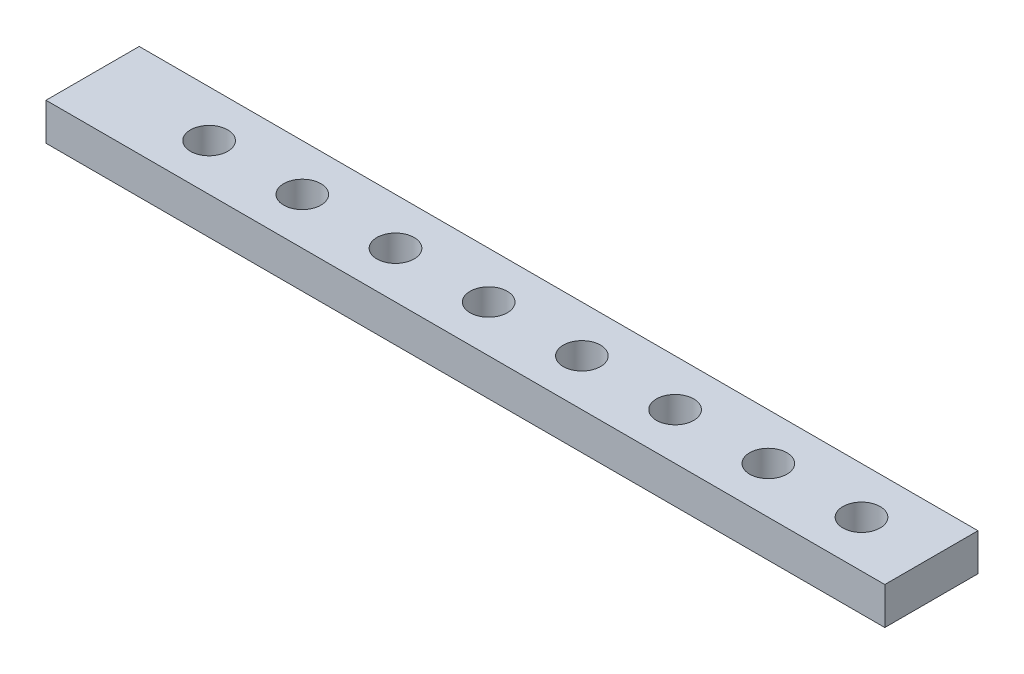
ISO-10303-21;
HEADER;
FILE_DESCRIPTION(('STEP AP214'),'2;1');
FILE_NAME('part.step','',(''),(''),'','','');
FILE_SCHEMA(('AUTOMOTIVE_DESIGN { 1 0 10303 214 1 1 1 1 }'));
ENDSEC;
DATA;
#1=APPLICATION_CONTEXT('core data for automotive mechanical design processes');
#2=APPLICATION_PROTOCOL_DEFINITION('international standard','automotive_design',2000,#1);
#3=PRODUCT_CONTEXT('',#1,'mechanical');
#4=PRODUCT('Part','Part','',(#3));
#5=PRODUCT_RELATED_PRODUCT_CATEGORY('part','',(#4));
#6=PRODUCT_DEFINITION_FORMATION('','',#4);
#7=PRODUCT_DEFINITION_CONTEXT('part definition',#1,'design');
#8=PRODUCT_DEFINITION('design','',#6,#7);
#9=PRODUCT_DEFINITION_SHAPE('','',#8);
#10=(LENGTH_UNIT() NAMED_UNIT(*) SI_UNIT(.MILLI.,.METRE.));
#11=(NAMED_UNIT(*) PLANE_ANGLE_UNIT() SI_UNIT($,.RADIAN.));
#12=(NAMED_UNIT(*) SI_UNIT($,.STERADIAN.) SOLID_ANGLE_UNIT());
#13=UNCERTAINTY_MEASURE_WITH_UNIT(LENGTH_MEASURE(1.E-05),#10,'distance_accuracy_value','');
#14=(GEOMETRIC_REPRESENTATION_CONTEXT(3) GLOBAL_UNCERTAINTY_ASSIGNED_CONTEXT((#13)) GLOBAL_UNIT_ASSIGNED_CONTEXT((#10,
#11,#12)) REPRESENTATION_CONTEXT('',''));
#15=CARTESIAN_POINT('',(0.,0.,0.));
#16=DIRECTION('',(0.,0.,1.));
#17=DIRECTION('',(1.,0.,0.));
#18=AXIS2_PLACEMENT_3D('',#15,#16,#17);
#19=CARTESIAN_POINT('',(0.,8.,0.));
#20=DIRECTION('',(0.,0.,-1.));
#21=DIRECTION('',(-1.,0.,0.));
#22=AXIS2_PLACEMENT_3D('',#19,#20,#21);
#23=PLANE('',#22);
#24=DIRECTION('',(0.,-1.,0.));
#25=VECTOR('',#24,1.);
#26=CARTESIAN_POINT('',(30.,10.,0.));
#27=LINE('',#26,#25);
#28=CARTESIAN_POINT('',(30.,8.,0.));
#29=VERTEX_POINT('',#28);
#30=CARTESIAN_POINT('',(30.,0.,0.));
#31=VERTEX_POINT('',#30);
#32=EDGE_CURVE('E200',#29,#31,#27,.T.);
#33=ORIENTED_EDGE('',*,*,#32,.T.);
#34=DIRECTION('',(1.,0.,0.));
#35=VECTOR('',#34,1.);
#36=CARTESIAN_POINT('',(0.,0.,0.));
#37=LINE('',#36,#35);
#38=CARTESIAN_POINT('',(210.,0.,0.));
#39=VERTEX_POINT('',#38);
#40=EDGE_CURVE('E80',#31,#39,#37,.T.);
#41=ORIENTED_EDGE('',*,*,#40,.T.);
#42=DIRECTION('',(0.,-1.,0.));
#43=VECTOR('',#42,1.);
#44=CARTESIAN_POINT('',(210.,8.,0.));
#45=LINE('',#44,#43);
#46=CARTESIAN_POINT('',(210.,8.,0.));
#47=VERTEX_POINT('',#46);
#48=EDGE_CURVE('E75',#47,#39,#45,.T.);
#49=ORIENTED_EDGE('',*,*,#48,.F.);
#50=DIRECTION('',(1.,0.,0.));
#51=VECTOR('',#50,1.);
#52=CARTESIAN_POINT('',(0.,8.,0.));
#53=LINE('',#52,#51);
#54=EDGE_CURVE('E89',#29,#47,#53,.T.);
#55=ORIENTED_EDGE('',*,*,#54,.F.);
#56=EDGE_LOOP('',(#33,#41,#49,#55));
#57=FACE_BOUND('',#56,.T.);
#58=ADVANCED_FACE('F32',(#57),#23,.F.);
#59=CARTESIAN_POINT('',(0.,8.,-20.));
#60=DIRECTION('',(0.,0.,1.));
#61=DIRECTION('',(1.,0.,0.));
#62=AXIS2_PLACEMENT_3D('',#59,#60,#61);
#63=PLANE('',#62);
#64=DIRECTION('',(0.,-1.,0.));
#65=VECTOR('',#64,1.);
#66=CARTESIAN_POINT('',(30.,10.,-20.));
#67=LINE('',#66,#65);
#68=CARTESIAN_POINT('',(30.,8.,-20.));
#69=VERTEX_POINT('',#68);
#70=CARTESIAN_POINT('',(30.,0.,-20.));
#71=VERTEX_POINT('',#70);
#72=EDGE_CURVE('E47',#69,#71,#67,.T.);
#73=ORIENTED_EDGE('',*,*,#72,.F.);
#74=DIRECTION('',(-1.,0.,0.));
#75=VECTOR('',#74,1.);
#76=CARTESIAN_POINT('',(0.,8.,-20.));
#77=LINE('',#76,#75);
#78=CARTESIAN_POINT('',(210.,8.,-20.));
#79=VERTEX_POINT('',#78);
#80=EDGE_CURVE('E85',#79,#69,#77,.T.);
#81=ORIENTED_EDGE('',*,*,#80,.F.);
#82=DIRECTION('',(0.,-1.,0.));
#83=VECTOR('',#82,1.);
#84=CARTESIAN_POINT('',(210.,8.,-20.));
#85=LINE('',#84,#83);
#86=CARTESIAN_POINT('',(210.,0.,-20.));
#87=VERTEX_POINT('',#86);
#88=EDGE_CURVE('E72',#79,#87,#85,.T.);
#89=ORIENTED_EDGE('',*,*,#88,.T.);
#90=DIRECTION('',(-1.,0.,0.));
#91=VECTOR('',#90,1.);
#92=CARTESIAN_POINT('',(0.,0.,-20.));
#93=LINE('',#92,#91);
#94=EDGE_CURVE('E79',#87,#71,#93,.T.);
#95=ORIENTED_EDGE('',*,*,#94,.T.);
#96=EDGE_LOOP('',(#73,#81,#89,#95));
#97=FACE_BOUND('',#96,.T.);
#98=ADVANCED_FACE('F84',(#97),#63,.F.);
#99=CARTESIAN_POINT('',(0.,8.,0.));
#100=DIRECTION('',(0.,-1.,0.));
#101=DIRECTION('',(0.,0.,-1.));
#102=AXIS2_PLACEMENT_3D('',#99,#100,#101);
#103=PLANE('',#102);
#104=CARTESIAN_POINT('',(55.,8.,-10.));
#105=DIRECTION('',(0.,1.,0.));
#106=DIRECTION('',(0.,0.,1.));
#107=AXIS2_PLACEMENT_3D('',#104,#105,#106);
#108=CIRCLE('',#107,3.99999999999999);
#109=CARTESIAN_POINT('',(55.,8.,-6.00000000000001));
#110=VERTEX_POINT('',#109);
#111=EDGE_CURVE('E11',#110,#110,#108,.T.);
#112=ORIENTED_EDGE('',*,*,#111,.F.);
#113=EDGE_LOOP('',(#112));
#114=FACE_BOUND('',#113,.T.);
#115=CARTESIAN_POINT('',(75.,8.,-10.));
#116=DIRECTION('',(0.,1.,0.));
#117=DIRECTION('',(0.,0.,1.));
#118=AXIS2_PLACEMENT_3D('',#115,#116,#117);
#119=CIRCLE('',#118,3.99999999999999);
#120=CARTESIAN_POINT('',(75.,8.,-6.00000000000001));
#121=VERTEX_POINT('',#120);
#122=EDGE_CURVE('E126',#121,#121,#119,.T.);
#123=ORIENTED_EDGE('',*,*,#122,.F.);
#124=EDGE_LOOP('',(#123));
#125=FACE_BOUND('',#124,.T.);
#126=CARTESIAN_POINT('',(95.,8.,-10.));
#127=DIRECTION('',(0.,1.,0.));
#128=DIRECTION('',(0.,0.,1.));
#129=AXIS2_PLACEMENT_3D('',#126,#127,#128);
#130=CIRCLE('',#129,3.99999999999999);
#131=CARTESIAN_POINT('',(95.,8.,-6.00000000000001));
#132=VERTEX_POINT('',#131);
#133=EDGE_CURVE('E120',#132,#132,#130,.T.);
#134=ORIENTED_EDGE('',*,*,#133,.F.);
#135=EDGE_LOOP('',(#134));
#136=FACE_BOUND('',#135,.T.);
#137=CARTESIAN_POINT('',(115.,8.,-10.));
#138=DIRECTION('',(0.,1.,0.));
#139=DIRECTION('',(0.,0.,1.));
#140=AXIS2_PLACEMENT_3D('',#137,#138,#139);
#141=CIRCLE('',#140,3.99999999999999);
#142=CARTESIAN_POINT('',(115.,8.,-6.00000000000001));
#143=VERTEX_POINT('',#142);
#144=EDGE_CURVE('E114',#143,#143,#141,.T.);
#145=ORIENTED_EDGE('',*,*,#144,.F.);
#146=EDGE_LOOP('',(#145));
#147=FACE_BOUND('',#146,.T.);
#148=CARTESIAN_POINT('',(135.,8.,-10.));
#149=DIRECTION('',(0.,1.,0.));
#150=DIRECTION('',(0.,0.,1.));
#151=AXIS2_PLACEMENT_3D('',#148,#149,#150);
#152=CIRCLE('',#151,3.99999999999999);
#153=CARTESIAN_POINT('',(135.,8.,-6.00000000000001));
#154=VERTEX_POINT('',#153);
#155=EDGE_CURVE('E108',#154,#154,#152,.T.);
#156=ORIENTED_EDGE('',*,*,#155,.F.);
#157=EDGE_LOOP('',(#156));
#158=FACE_BOUND('',#157,.T.);
#159=CARTESIAN_POINT('',(155.,8.,-10.));
#160=DIRECTION('',(0.,1.,0.));
#161=DIRECTION('',(0.,0.,1.));
#162=AXIS2_PLACEMENT_3D('',#159,#160,#161);
#163=CIRCLE('',#162,3.99999999999999);
#164=CARTESIAN_POINT('',(155.,8.,-6.00000000000001));
#165=VERTEX_POINT('',#164);
#166=EDGE_CURVE('E102',#165,#165,#163,.T.);
#167=ORIENTED_EDGE('',*,*,#166,.F.);
#168=EDGE_LOOP('',(#167));
#169=FACE_BOUND('',#168,.T.);
#170=CARTESIAN_POINT('',(195.,8.,-10.));
#171=DIRECTION('',(0.,1.,0.));
#172=DIRECTION('',(0.,0.,1.));
#173=AXIS2_PLACEMENT_3D('',#170,#171,#172);
#174=CIRCLE('',#173,3.99999999999999);
#175=CARTESIAN_POINT('',(195.,8.,-6.00000000000001));
#176=VERTEX_POINT('',#175);
#177=EDGE_CURVE('E99',#176,#176,#174,.T.);
#178=ORIENTED_EDGE('',*,*,#177,.F.);
#179=EDGE_LOOP('',(#178));
#180=FACE_BOUND('',#179,.T.);
#181=CARTESIAN_POINT('',(175.,8.,-10.));
#182=DIRECTION('',(0.,1.,0.));
#183=DIRECTION('',(0.,0.,1.));
#184=AXIS2_PLACEMENT_3D('',#181,#182,#183);
#185=CIRCLE('',#184,3.99999999999999);
#186=CARTESIAN_POINT('',(175.,8.,-6.00000000000001));
#187=VERTEX_POINT('',#186);
#188=EDGE_CURVE('E193',#187,#187,#185,.T.);
#189=ORIENTED_EDGE('',*,*,#188,.F.);
#190=EDGE_LOOP('',(#189));
#191=FACE_BOUND('',#190,.T.);
#192=DIRECTION('',(0.,0.,-1.));
#193=VECTOR('',#192,1.);
#194=CARTESIAN_POINT('',(30.,8.,0.));
#195=LINE('',#194,#193);
#196=EDGE_CURVE('E195',#29,#69,#195,.T.);
#197=ORIENTED_EDGE('',*,*,#196,.F.);
#198=ORIENTED_EDGE('',*,*,#54,.T.);
#199=DIRECTION('',(0.,0.,-1.));
#200=VECTOR('',#199,1.);
#201=CARTESIAN_POINT('',(210.,8.,0.));
#202=LINE('',#201,#200);
#203=EDGE_CURVE('E56',#47,#79,#202,.T.);
#204=ORIENTED_EDGE('',*,*,#203,.T.);
#205=ORIENTED_EDGE('',*,*,#80,.T.);
#206=EDGE_LOOP('',(#197,#198,#204,#205));
#207=FACE_BOUND('',#206,.T.);
#208=ADVANCED_FACE('F134',(#114,#125,#136,#147,#158,#169,#180,#191,#207),#103,.F.);
#209=CARTESIAN_POINT('',(0.,0.,0.));
#210=DIRECTION('',(0.,-1.,0.));
#211=DIRECTION('',(0.,0.,-1.));
#212=AXIS2_PLACEMENT_3D('',#209,#210,#211);
#213=PLANE('',#212);
#214=CARTESIAN_POINT('',(175.,0.,-10.));
#215=DIRECTION('',(0.,-1.,0.));
#216=DIRECTION('',(0.,0.,-1.));
#217=AXIS2_PLACEMENT_3D('',#214,#215,#216);
#218=CIRCLE('',#217,3.99999999999999);
#219=CARTESIAN_POINT('',(175.,0.,-14.));
#220=VERTEX_POINT('',#219);
#221=EDGE_CURVE('E199',#220,#220,#218,.T.);
#222=ORIENTED_EDGE('',*,*,#221,.F.);
#223=EDGE_LOOP('',(#222));
#224=FACE_BOUND('',#223,.T.);
#225=CARTESIAN_POINT('',(195.,0.,-10.));
#226=DIRECTION('',(0.,-1.,0.));
#227=DIRECTION('',(0.,0.,-1.));
#228=AXIS2_PLACEMENT_3D('',#225,#226,#227);
#229=CIRCLE('',#228,3.99999999999999);
#230=CARTESIAN_POINT('',(195.,0.,-14.));
#231=VERTEX_POINT('',#230);
#232=EDGE_CURVE('E96',#231,#231,#229,.T.);
#233=ORIENTED_EDGE('',*,*,#232,.F.);
#234=EDGE_LOOP('',(#233));
#235=FACE_BOUND('',#234,.T.);
#236=CARTESIAN_POINT('',(155.,0.,-10.));
#237=DIRECTION('',(0.,-1.,0.));
#238=DIRECTION('',(0.,0.,-1.));
#239=AXIS2_PLACEMENT_3D('',#236,#237,#238);
#240=CIRCLE('',#239,3.99999999999999);
#241=CARTESIAN_POINT('',(155.,0.,-14.));
#242=VERTEX_POINT('',#241);
#243=EDGE_CURVE('E95',#242,#242,#240,.T.);
#244=ORIENTED_EDGE('',*,*,#243,.F.);
#245=EDGE_LOOP('',(#244));
#246=FACE_BOUND('',#245,.T.);
#247=CARTESIAN_POINT('',(135.,0.,-10.));
#248=DIRECTION('',(0.,-1.,0.));
#249=DIRECTION('',(0.,0.,-1.));
#250=AXIS2_PLACEMENT_3D('',#247,#248,#249);
#251=CIRCLE('',#250,3.99999999999999);
#252=CARTESIAN_POINT('',(135.,0.,-14.));
#253=VERTEX_POINT('',#252);
#254=EDGE_CURVE('E105',#253,#253,#251,.T.);
#255=ORIENTED_EDGE('',*,*,#254,.F.);
#256=EDGE_LOOP('',(#255));
#257=FACE_BOUND('',#256,.T.);
#258=CARTESIAN_POINT('',(115.,0.,-10.));
#259=DIRECTION('',(0.,-1.,0.));
#260=DIRECTION('',(0.,0.,-1.));
#261=AXIS2_PLACEMENT_3D('',#258,#259,#260);
#262=CIRCLE('',#261,3.99999999999999);
#263=CARTESIAN_POINT('',(115.,0.,-14.));
#264=VERTEX_POINT('',#263);
#265=EDGE_CURVE('E111',#264,#264,#262,.T.);
#266=ORIENTED_EDGE('',*,*,#265,.F.);
#267=EDGE_LOOP('',(#266));
#268=FACE_BOUND('',#267,.T.);
#269=CARTESIAN_POINT('',(95.,0.,-10.));
#270=DIRECTION('',(0.,-1.,0.));
#271=DIRECTION('',(0.,0.,-1.));
#272=AXIS2_PLACEMENT_3D('',#269,#270,#271);
#273=CIRCLE('',#272,3.99999999999999);
#274=CARTESIAN_POINT('',(95.,0.,-14.));
#275=VERTEX_POINT('',#274);
#276=EDGE_CURVE('E117',#275,#275,#273,.T.);
#277=ORIENTED_EDGE('',*,*,#276,.F.);
#278=EDGE_LOOP('',(#277));
#279=FACE_BOUND('',#278,.T.);
#280=CARTESIAN_POINT('',(75.,0.,-10.));
#281=DIRECTION('',(0.,-1.,0.));
#282=DIRECTION('',(0.,0.,-1.));
#283=AXIS2_PLACEMENT_3D('',#280,#281,#282);
#284=CIRCLE('',#283,3.99999999999999);
#285=CARTESIAN_POINT('',(75.,0.,-14.));
#286=VERTEX_POINT('',#285);
#287=EDGE_CURVE('E123',#286,#286,#284,.T.);
#288=ORIENTED_EDGE('',*,*,#287,.F.);
#289=EDGE_LOOP('',(#288));
#290=FACE_BOUND('',#289,.T.);
#291=CARTESIAN_POINT('',(55.,0.,-10.));
#292=DIRECTION('',(0.,-1.,0.));
#293=DIRECTION('',(0.,0.,-1.));
#294=AXIS2_PLACEMENT_3D('',#291,#292,#293);
#295=CIRCLE('',#294,3.99999999999999);
#296=CARTESIAN_POINT('',(55.,0.,-14.));
#297=VERTEX_POINT('',#296);
#298=EDGE_CURVE('E40',#297,#297,#295,.T.);
#299=ORIENTED_EDGE('',*,*,#298,.F.);
#300=EDGE_LOOP('',(#299));
#301=FACE_BOUND('',#300,.T.);
#302=ORIENTED_EDGE('',*,*,#40,.F.);
#303=DIRECTION('',(0.,0.,-1.));
#304=VECTOR('',#303,1.);
#305=CARTESIAN_POINT('',(30.,0.,-20.));
#306=LINE('',#305,#304);
#307=EDGE_CURVE('E88',#31,#71,#306,.T.);
#308=ORIENTED_EDGE('',*,*,#307,.T.);
#309=ORIENTED_EDGE('',*,*,#94,.F.);
#310=DIRECTION('',(0.,0.,-1.));
#311=VECTOR('',#310,1.);
#312=CARTESIAN_POINT('',(210.,0.,0.));
#313=LINE('',#312,#311);
#314=EDGE_CURVE('E69',#39,#87,#313,.T.);
#315=ORIENTED_EDGE('',*,*,#314,.F.);
#316=EDGE_LOOP('',(#302,#308,#309,#315));
#317=FACE_BOUND('',#316,.T.);
#318=ADVANCED_FACE('F87',(#224,#235,#246,#257,#268,#279,#290,#301,#317),#213,.T.);
#319=CARTESIAN_POINT('',(55.,-2.,-10.));
#320=DIRECTION('',(0.,1.,0.));
#321=DIRECTION('',(0.,0.,1.));
#322=AXIS2_PLACEMENT_3D('',#319,#320,#321);
#323=CYLINDRICAL_SURFACE('',#322,3.99999999999999);
#324=ORIENTED_EDGE('',*,*,#298,.T.);
#325=EDGE_LOOP('',(#324));
#326=FACE_BOUND('',#325,.T.);
#327=ORIENTED_EDGE('',*,*,#111,.T.);
#328=EDGE_LOOP('',(#327));
#329=FACE_BOUND('',#328,.T.);
#330=ADVANCED_FACE('F34',(#326,#329),#323,.F.);
#331=CARTESIAN_POINT('',(75.,-2.,-10.));
#332=DIRECTION('',(0.,1.,0.));
#333=DIRECTION('',(0.,0.,1.));
#334=AXIS2_PLACEMENT_3D('',#331,#332,#333);
#335=CYLINDRICAL_SURFACE('',#334,3.99999999999999);
#336=ORIENTED_EDGE('',*,*,#287,.T.);
#337=EDGE_LOOP('',(#336));
#338=FACE_BOUND('',#337,.T.);
#339=ORIENTED_EDGE('',*,*,#122,.T.);
#340=EDGE_LOOP('',(#339));
#341=FACE_BOUND('',#340,.T.);
#342=ADVANCED_FACE('F141',(#338,#341),#335,.F.);
#343=CARTESIAN_POINT('',(95.,-2.,-10.));
#344=DIRECTION('',(0.,1.,0.));
#345=DIRECTION('',(0.,0.,1.));
#346=AXIS2_PLACEMENT_3D('',#343,#344,#345);
#347=CYLINDRICAL_SURFACE('',#346,3.99999999999999);
#348=ORIENTED_EDGE('',*,*,#276,.T.);
#349=EDGE_LOOP('',(#348));
#350=FACE_BOUND('',#349,.T.);
#351=ORIENTED_EDGE('',*,*,#133,.T.);
#352=EDGE_LOOP('',(#351));
#353=FACE_BOUND('',#352,.T.);
#354=ADVANCED_FACE('F167',(#350,#353),#347,.F.);
#355=CARTESIAN_POINT('',(115.,-2.,-10.));
#356=DIRECTION('',(0.,1.,0.));
#357=DIRECTION('',(0.,0.,1.));
#358=AXIS2_PLACEMENT_3D('',#355,#356,#357);
#359=CYLINDRICAL_SURFACE('',#358,3.99999999999999);
#360=ORIENTED_EDGE('',*,*,#265,.T.);
#361=EDGE_LOOP('',(#360));
#362=FACE_BOUND('',#361,.T.);
#363=ORIENTED_EDGE('',*,*,#144,.T.);
#364=EDGE_LOOP('',(#363));
#365=FACE_BOUND('',#364,.T.);
#366=ADVANCED_FACE('F163',(#362,#365),#359,.F.);
#367=CARTESIAN_POINT('',(135.,-2.,-10.));
#368=DIRECTION('',(0.,1.,0.));
#369=DIRECTION('',(0.,0.,1.));
#370=AXIS2_PLACEMENT_3D('',#367,#368,#369);
#371=CYLINDRICAL_SURFACE('',#370,3.99999999999999);
#372=ORIENTED_EDGE('',*,*,#254,.T.);
#373=EDGE_LOOP('',(#372));
#374=FACE_BOUND('',#373,.T.);
#375=ORIENTED_EDGE('',*,*,#155,.T.);
#376=EDGE_LOOP('',(#375));
#377=FACE_BOUND('',#376,.T.);
#378=ADVANCED_FACE('F159',(#374,#377),#371,.F.);
#379=CARTESIAN_POINT('',(155.,-2.,-10.));
#380=DIRECTION('',(0.,1.,0.));
#381=DIRECTION('',(0.,0.,1.));
#382=AXIS2_PLACEMENT_3D('',#379,#380,#381);
#383=CYLINDRICAL_SURFACE('',#382,3.99999999999999);
#384=ORIENTED_EDGE('',*,*,#243,.T.);
#385=EDGE_LOOP('',(#384));
#386=FACE_BOUND('',#385,.T.);
#387=ORIENTED_EDGE('',*,*,#166,.T.);
#388=EDGE_LOOP('',(#387));
#389=FACE_BOUND('',#388,.T.);
#390=ADVANCED_FACE('F156',(#386,#389),#383,.F.);
#391=CARTESIAN_POINT('',(210.,8.,0.));
#392=DIRECTION('',(-1.,0.,0.));
#393=DIRECTION('',(0.,0.,1.));
#394=AXIS2_PLACEMENT_3D('',#391,#392,#393);
#395=PLANE('',#394);
#396=ORIENTED_EDGE('',*,*,#314,.T.);
#397=ORIENTED_EDGE('',*,*,#88,.F.);
#398=ORIENTED_EDGE('',*,*,#203,.F.);
#399=ORIENTED_EDGE('',*,*,#48,.T.);
#400=EDGE_LOOP('',(#396,#397,#398,#399));
#401=FACE_BOUND('',#400,.T.);
#402=ADVANCED_FACE('F71',(#401),#395,.F.);
#403=CARTESIAN_POINT('',(195.,-2.,-10.));
#404=DIRECTION('',(0.,1.,0.));
#405=DIRECTION('',(0.,0.,1.));
#406=AXIS2_PLACEMENT_3D('',#403,#404,#405);
#407=CYLINDRICAL_SURFACE('',#406,3.99999999999999);
#408=ORIENTED_EDGE('',*,*,#232,.T.);
#409=EDGE_LOOP('',(#408));
#410=FACE_BOUND('',#409,.T.);
#411=ORIENTED_EDGE('',*,*,#177,.T.);
#412=EDGE_LOOP('',(#411));
#413=FACE_BOUND('',#412,.T.);
#414=ADVANCED_FACE('F217',(#410,#413),#407,.F.);
#415=CARTESIAN_POINT('',(175.,-2.,-10.));
#416=DIRECTION('',(0.,1.,0.));
#417=DIRECTION('',(0.,0.,1.));
#418=AXIS2_PLACEMENT_3D('',#415,#416,#417);
#419=CYLINDRICAL_SURFACE('',#418,3.99999999999999);
#420=ORIENTED_EDGE('',*,*,#221,.T.);
#421=EDGE_LOOP('',(#420));
#422=FACE_BOUND('',#421,.T.);
#423=ORIENTED_EDGE('',*,*,#188,.T.);
#424=EDGE_LOOP('',(#423));
#425=FACE_BOUND('',#424,.T.);
#426=ADVANCED_FACE('F213',(#422,#425),#419,.F.);
#427=CARTESIAN_POINT('',(30.,10.,-20.));
#428=DIRECTION('',(-1.,0.,0.));
#429=DIRECTION('',(0.,0.,1.));
#430=AXIS2_PLACEMENT_3D('',#427,#428,#429);
#431=PLANE('',#430);
#432=ORIENTED_EDGE('',*,*,#196,.T.);
#433=ORIENTED_EDGE('',*,*,#72,.T.);
#434=ORIENTED_EDGE('',*,*,#307,.F.);
#435=ORIENTED_EDGE('',*,*,#32,.F.);
#436=EDGE_LOOP('',(#432,#433,#434,#435));
#437=FACE_BOUND('',#436,.T.);
#438=ADVANCED_FACE('F216',(#437),#431,.T.);
#439=CLOSED_SHELL('',(#58,#98,#208,#318,#330,#342,#354,#366,#378,#390,#402,#414,#426,#438));
#440=MANIFOLD_SOLID_BREP('B2',#439);
#441=ADVANCED_BREP_SHAPE_REPRESENTATION('',(#18,#440),#14);
#442=SHAPE_DEFINITION_REPRESENTATION(#9,#441);
ENDSEC;
END-ISO-10303-21;
